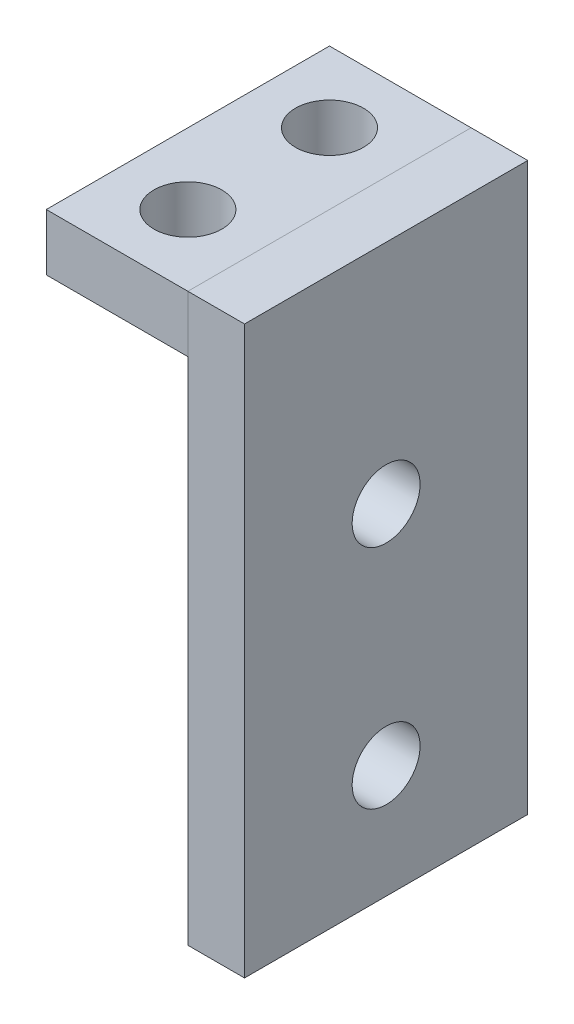
ISO-10303-21;
HEADER;
FILE_DESCRIPTION(('STEP AP214'),'2;1');
FILE_NAME('part.step','',(''),(''),'','','');
FILE_SCHEMA(('AUTOMOTIVE_DESIGN { 1 0 10303 214 1 1 1 1 }'));
ENDSEC;
DATA;
#1=APPLICATION_CONTEXT('core data for automotive mechanical design processes');
#2=APPLICATION_PROTOCOL_DEFINITION('international standard','automotive_design',2000,#1);
#3=PRODUCT_CONTEXT('',#1,'mechanical');
#4=PRODUCT('Part','Part','',(#3));
#5=PRODUCT_RELATED_PRODUCT_CATEGORY('part','',(#4));
#6=PRODUCT_DEFINITION_FORMATION('','',#4);
#7=PRODUCT_DEFINITION_CONTEXT('part definition',#1,'design');
#8=PRODUCT_DEFINITION('design','',#6,#7);
#9=PRODUCT_DEFINITION_SHAPE('','',#8);
#10=(LENGTH_UNIT() NAMED_UNIT(*) SI_UNIT(.MILLI.,.METRE.));
#11=(NAMED_UNIT(*) PLANE_ANGLE_UNIT() SI_UNIT($,.RADIAN.));
#12=(NAMED_UNIT(*) SI_UNIT($,.STERADIAN.) SOLID_ANGLE_UNIT());
#13=UNCERTAINTY_MEASURE_WITH_UNIT(LENGTH_MEASURE(1.E-05),#10,'distance_accuracy_value','');
#14=(GEOMETRIC_REPRESENTATION_CONTEXT(3) GLOBAL_UNCERTAINTY_ASSIGNED_CONTEXT((#13)) GLOBAL_UNIT_ASSIGNED_CONTEXT((#10,
#11,#12)) REPRESENTATION_CONTEXT('',''));
#15=CARTESIAN_POINT('',(0.,0.,0.));
#16=DIRECTION('',(0.,0.,1.));
#17=DIRECTION('',(1.,0.,0.));
#18=AXIS2_PLACEMENT_3D('',#15,#16,#17);
#19=CARTESIAN_POINT('',(6.35,-22.86,-12.7));
#20=DIRECTION('',(-1.,0.,0.));
#21=DIRECTION('',(0.,0.,1.));
#22=AXIS2_PLACEMENT_3D('',#19,#20,#21);
#23=PLANE('',#22);
#24=CARTESIAN_POINT('',(6.35,-7.62,-6.35));
#25=DIRECTION('',(-1.,0.,0.));
#26=DIRECTION('',(0.,0.,1.));
#27=AXIS2_PLACEMENT_3D('',#24,#25,#26);
#28=CIRCLE('',#27,1.524);
#29=CARTESIAN_POINT('',(6.35,-7.62,-4.826));
#30=VERTEX_POINT('',#29);
#31=EDGE_CURVE('E175',#30,#30,#28,.T.);
#32=ORIENTED_EDGE('',*,*,#31,.F.);
#33=EDGE_LOOP('',(#32));
#34=FACE_BOUND('',#33,.T.);
#35=CARTESIAN_POINT('',(6.35,-17.78,-6.35));
#36=DIRECTION('',(-1.,0.,0.));
#37=DIRECTION('',(0.,0.,1.));
#38=AXIS2_PLACEMENT_3D('',#35,#36,#37);
#39=CIRCLE('',#38,1.524);
#40=CARTESIAN_POINT('',(6.35,-17.78,-4.826));
#41=VERTEX_POINT('',#40);
#42=EDGE_CURVE('E177',#41,#41,#39,.T.);
#43=ORIENTED_EDGE('',*,*,#42,.F.);
#44=EDGE_LOOP('',(#43));
#45=FACE_BOUND('',#44,.T.);
#46=DIRECTION('',(0.,0.,1.));
#47=VECTOR('',#46,1.);
#48=CARTESIAN_POINT('',(6.35,2.54,-12.7));
#49=LINE('',#48,#47);
#50=CARTESIAN_POINT('',(6.35,2.54,-12.7));
#51=VERTEX_POINT('',#50);
#52=CARTESIAN_POINT('',(6.35,2.54,0.));
#53=VERTEX_POINT('',#52);
#54=EDGE_CURVE('E124',#51,#53,#49,.T.);
#55=ORIENTED_EDGE('',*,*,#54,.F.);
#56=DIRECTION('',(0.,1.,0.));
#57=VECTOR('',#56,1.);
#58=CARTESIAN_POINT('',(6.35,-22.86,-12.7));
#59=LINE('',#58,#57);
#60=CARTESIAN_POINT('',(6.35,-22.86,-12.7));
#61=VERTEX_POINT('',#60);
#62=EDGE_CURVE('E12',#61,#51,#59,.T.);
#63=ORIENTED_EDGE('',*,*,#62,.F.);
#64=DIRECTION('',(0.,0.,1.));
#65=VECTOR('',#64,1.);
#66=CARTESIAN_POINT('',(6.35,-22.86,-12.7));
#67=LINE('',#66,#65);
#68=CARTESIAN_POINT('',(6.35,-22.86,0.));
#69=VERTEX_POINT('',#68);
#70=EDGE_CURVE('E115',#61,#69,#67,.T.);
#71=ORIENTED_EDGE('',*,*,#70,.T.);
#72=DIRECTION('',(0.,1.,0.));
#73=VECTOR('',#72,1.);
#74=CARTESIAN_POINT('',(6.35,-22.86,0.));
#75=LINE('',#74,#73);
#76=EDGE_CURVE('E56',#69,#53,#75,.T.);
#77=ORIENTED_EDGE('',*,*,#76,.T.);
#78=EDGE_LOOP('',(#55,#63,#71,#77));
#79=FACE_BOUND('',#78,.T.);
#80=ADVANCED_FACE('F53',(#34,#45,#79),#23,.T.);
#81=CARTESIAN_POINT('',(6.35,-22.86,-12.7));
#82=DIRECTION('',(0.,0.,-1.));
#83=DIRECTION('',(-1.,0.,0.));
#84=AXIS2_PLACEMENT_3D('',#81,#82,#83);
#85=PLANE('',#84);
#86=DIRECTION('',(-1.,0.,0.));
#87=VECTOR('',#86,1.);
#88=CARTESIAN_POINT('',(6.35,2.54,-12.7));
#89=LINE('',#88,#87);
#90=CARTESIAN_POINT('',(8.89,2.54,-12.7));
#91=VERTEX_POINT('',#90);
#92=EDGE_CURVE('E118',#91,#51,#89,.T.);
#93=ORIENTED_EDGE('',*,*,#92,.F.);
#94=DIRECTION('',(0.,1.,0.));
#95=VECTOR('',#94,1.);
#96=CARTESIAN_POINT('',(8.89,-22.86,-12.7));
#97=LINE('',#96,#95);
#98=CARTESIAN_POINT('',(8.89,-22.86,-12.7));
#99=VERTEX_POINT('',#98);
#100=EDGE_CURVE('E63',#99,#91,#97,.T.);
#101=ORIENTED_EDGE('',*,*,#100,.F.);
#102=DIRECTION('',(-1.,0.,0.));
#103=VECTOR('',#102,1.);
#104=CARTESIAN_POINT('',(6.35,-22.86,-12.7));
#105=LINE('',#104,#103);
#106=EDGE_CURVE('E110',#99,#61,#105,.T.);
#107=ORIENTED_EDGE('',*,*,#106,.T.);
#108=ORIENTED_EDGE('',*,*,#62,.T.);
#109=EDGE_LOOP('',(#93,#101,#107,#108));
#110=FACE_BOUND('',#109,.T.);
#111=ADVANCED_FACE('F141',(#110),#85,.T.);
#112=CARTESIAN_POINT('',(8.89,-22.86,-12.7));
#113=DIRECTION('',(1.,0.,0.));
#114=DIRECTION('',(0.,0.,-1.));
#115=AXIS2_PLACEMENT_3D('',#112,#113,#114);
#116=PLANE('',#115);
#117=CARTESIAN_POINT('',(8.89,-7.62,-6.35));
#118=DIRECTION('',(-1.,0.,0.));
#119=DIRECTION('',(0.,0.,1.));
#120=AXIS2_PLACEMENT_3D('',#117,#118,#119);
#121=CIRCLE('',#120,1.524);
#122=CARTESIAN_POINT('',(8.89,-7.62,-4.826));
#123=VERTEX_POINT('',#122);
#124=EDGE_CURVE('E129',#123,#123,#121,.T.);
#125=ORIENTED_EDGE('',*,*,#124,.T.);
#126=EDGE_LOOP('',(#125));
#127=FACE_BOUND('',#126,.T.);
#128=CARTESIAN_POINT('',(8.89,-17.78,-6.35));
#129=DIRECTION('',(-1.,0.,0.));
#130=DIRECTION('',(0.,0.,1.));
#131=AXIS2_PLACEMENT_3D('',#128,#129,#130);
#132=CIRCLE('',#131,1.524);
#133=CARTESIAN_POINT('',(8.89,-17.78,-4.826));
#134=VERTEX_POINT('',#133);
#135=EDGE_CURVE('E183',#134,#134,#132,.T.);
#136=ORIENTED_EDGE('',*,*,#135,.T.);
#137=EDGE_LOOP('',(#136));
#138=FACE_BOUND('',#137,.T.);
#139=DIRECTION('',(0.,0.,-1.));
#140=VECTOR('',#139,1.);
#141=CARTESIAN_POINT('',(8.89,2.54,-12.7));
#142=LINE('',#141,#140);
#143=CARTESIAN_POINT('',(8.89,2.54,0.));
#144=VERTEX_POINT('',#143);
#145=EDGE_CURVE('E104',#144,#91,#142,.T.);
#146=ORIENTED_EDGE('',*,*,#145,.F.);
#147=DIRECTION('',(0.,1.,0.));
#148=VECTOR('',#147,1.);
#149=CARTESIAN_POINT('',(8.89,-22.86,0.));
#150=LINE('',#149,#148);
#151=CARTESIAN_POINT('',(8.89,-22.86,0.));
#152=VERTEX_POINT('',#151);
#153=EDGE_CURVE('E99',#152,#144,#150,.T.);
#154=ORIENTED_EDGE('',*,*,#153,.F.);
#155=DIRECTION('',(0.,0.,-1.));
#156=VECTOR('',#155,1.);
#157=CARTESIAN_POINT('',(8.89,-22.86,-12.7));
#158=LINE('',#157,#156);
#159=EDGE_CURVE('E102',#152,#99,#158,.T.);
#160=ORIENTED_EDGE('',*,*,#159,.T.);
#161=ORIENTED_EDGE('',*,*,#100,.T.);
#162=EDGE_LOOP('',(#146,#154,#160,#161));
#163=FACE_BOUND('',#162,.T.);
#164=ADVANCED_FACE('F101',(#127,#138,#163),#116,.T.);
#165=CARTESIAN_POINT('',(6.35,-22.86,0.));
#166=DIRECTION('',(0.,0.,1.));
#167=DIRECTION('',(1.,0.,0.));
#168=AXIS2_PLACEMENT_3D('',#165,#166,#167);
#169=PLANE('',#168);
#170=DIRECTION('',(1.,0.,0.));
#171=VECTOR('',#170,1.);
#172=CARTESIAN_POINT('',(6.35,2.54,0.));
#173=LINE('',#172,#171);
#174=EDGE_CURVE('E128',#53,#144,#173,.T.);
#175=ORIENTED_EDGE('',*,*,#174,.F.);
#176=ORIENTED_EDGE('',*,*,#76,.F.);
#177=DIRECTION('',(1.,0.,0.));
#178=VECTOR('',#177,1.);
#179=CARTESIAN_POINT('',(6.35,-22.86,0.));
#180=LINE('',#179,#178);
#181=EDGE_CURVE('E109',#69,#152,#180,.T.);
#182=ORIENTED_EDGE('',*,*,#181,.T.);
#183=ORIENTED_EDGE('',*,*,#153,.T.);
#184=EDGE_LOOP('',(#175,#176,#182,#183));
#185=FACE_BOUND('',#184,.T.);
#186=ADVANCED_FACE('F113',(#185),#169,.T.);
#187=CARTESIAN_POINT('',(0.,-22.86,0.));
#188=DIRECTION('',(0.,1.,0.));
#189=DIRECTION('',(0.,0.,1.));
#190=AXIS2_PLACEMENT_3D('',#187,#188,#189);
#191=PLANE('',#190);
#192=ORIENTED_EDGE('',*,*,#70,.F.);
#193=ORIENTED_EDGE('',*,*,#106,.F.);
#194=ORIENTED_EDGE('',*,*,#159,.F.);
#195=ORIENTED_EDGE('',*,*,#181,.F.);
#196=EDGE_LOOP('',(#192,#193,#194,#195));
#197=FACE_BOUND('',#196,.T.);
#198=ADVANCED_FACE('F108',(#197),#191,.F.);
#199=CARTESIAN_POINT('',(0.,2.54,0.));
#200=DIRECTION('',(0.,1.,0.));
#201=DIRECTION('',(0.,0.,1.));
#202=AXIS2_PLACEMENT_3D('',#199,#200,#201);
#203=PLANE('',#202);
#204=ORIENTED_EDGE('',*,*,#54,.T.);
#205=ORIENTED_EDGE('',*,*,#174,.T.);
#206=ORIENTED_EDGE('',*,*,#145,.T.);
#207=ORIENTED_EDGE('',*,*,#92,.T.);
#208=EDGE_LOOP('',(#204,#205,#206,#207));
#209=FACE_BOUND('',#208,.T.);
#210=ADVANCED_FACE('F140',(#209),#203,.T.);
#211=CARTESIAN_POINT('',(8.89,-17.78,-6.35));
#212=DIRECTION('',(-1.,0.,0.));
#213=DIRECTION('',(0.,0.,1.));
#214=AXIS2_PLACEMENT_3D('',#211,#212,#213);
#215=CYLINDRICAL_SURFACE('',#214,1.524);
#216=ORIENTED_EDGE('',*,*,#135,.F.);
#217=EDGE_LOOP('',(#216));
#218=FACE_BOUND('',#217,.T.);
#219=ORIENTED_EDGE('',*,*,#42,.T.);
#220=EDGE_LOOP('',(#219));
#221=FACE_BOUND('',#220,.T.);
#222=ADVANCED_FACE('F160',(#218,#221),#215,.F.);
#223=CARTESIAN_POINT('',(8.89,-7.62,-6.35));
#224=DIRECTION('',(-1.,0.,0.));
#225=DIRECTION('',(0.,0.,1.));
#226=AXIS2_PLACEMENT_3D('',#223,#224,#225);
#227=CYLINDRICAL_SURFACE('',#226,1.524);
#228=ORIENTED_EDGE('',*,*,#124,.F.);
#229=EDGE_LOOP('',(#228));
#230=FACE_BOUND('',#229,.T.);
#231=ORIENTED_EDGE('',*,*,#31,.T.);
#232=EDGE_LOOP('',(#231));
#233=FACE_BOUND('',#232,.T.);
#234=ADVANCED_FACE('F164',(#230,#233),#227,.F.);
#235=CLOSED_SHELL('',(#80,#111,#164,#186,#198,#210,#222,#234));
#236=MANIFOLD_SOLID_BREP('B2',#235);
#237=CARTESIAN_POINT('',(0.,2.54,0.));
#238=DIRECTION('',(0.,-1.,0.));
#239=DIRECTION('',(0.,0.,-1.));
#240=AXIS2_PLACEMENT_3D('',#237,#238,#239);
#241=PLANE('',#240);
#242=DIRECTION('',(0.,0.,1.));
#243=VECTOR('',#242,1.);
#244=CARTESIAN_POINT('',(0.,2.54,0.));
#245=LINE('',#244,#243);
#246=CARTESIAN_POINT('',(0.,2.54,-12.7));
#247=VERTEX_POINT('',#246);
#248=CARTESIAN_POINT('',(0.,2.54,0.));
#249=VERTEX_POINT('',#248);
#250=EDGE_CURVE('E303',#247,#249,#245,.T.);
#251=ORIENTED_EDGE('',*,*,#250,.T.);
#252=DIRECTION('',(1.,0.,0.));
#253=VECTOR('',#252,1.);
#254=CARTESIAN_POINT('',(0.,2.54,0.));
#255=LINE('',#254,#253);
#256=CARTESIAN_POINT('',(6.35,2.54,0.));
#257=VERTEX_POINT('',#256);
#258=EDGE_CURVE('E298',#249,#257,#255,.T.);
#259=ORIENTED_EDGE('',*,*,#258,.T.);
#260=DIRECTION('',(0.,0.,-1.));
#261=VECTOR('',#260,1.);
#262=CARTESIAN_POINT('',(6.35,2.54,0.));
#263=LINE('',#262,#261);
#264=CARTESIAN_POINT('',(6.35,2.54,-12.7));
#265=VERTEX_POINT('',#264);
#266=EDGE_CURVE('E301',#257,#265,#263,.T.);
#267=ORIENTED_EDGE('',*,*,#266,.T.);
#268=DIRECTION('',(-1.,0.,0.));
#269=VECTOR('',#268,1.);
#270=CARTESIAN_POINT('',(0.,2.54,-12.7));
#271=LINE('',#270,#269);
#272=EDGE_CURVE('E268',#265,#247,#271,.T.);
#273=ORIENTED_EDGE('',*,*,#272,.T.);
#274=EDGE_LOOP('',(#251,#259,#267,#273));
#275=FACE_BOUND('',#274,.T.);
#276=CARTESIAN_POINT('',(3.175,2.54,-3.175));
#277=DIRECTION('',(0.,1.,0.));
#278=DIRECTION('',(0.,0.,1.));
#279=AXIS2_PLACEMENT_3D('',#276,#277,#278);
#280=CIRCLE('',#279,1.524);
#281=CARTESIAN_POINT('',(3.175,2.54,-1.651));
#282=VERTEX_POINT('',#281);
#283=EDGE_CURVE('E318',#282,#282,#280,.T.);
#284=ORIENTED_EDGE('',*,*,#283,.F.);
#285=EDGE_LOOP('',(#284));
#286=FACE_BOUND('',#285,.T.);
#287=CARTESIAN_POINT('',(3.175,2.54,-9.525));
#288=DIRECTION('',(0.,1.,0.));
#289=DIRECTION('',(0.,0.,1.));
#290=AXIS2_PLACEMENT_3D('',#287,#288,#289);
#291=CIRCLE('',#290,1.524);
#292=CARTESIAN_POINT('',(3.175,2.54,-8.001));
#293=VERTEX_POINT('',#292);
#294=EDGE_CURVE('E333',#293,#293,#291,.T.);
#295=ORIENTED_EDGE('',*,*,#294,.F.);
#296=EDGE_LOOP('',(#295));
#297=FACE_BOUND('',#296,.T.);
#298=ADVANCED_FACE('F251',(#275,#286,#297),#241,.F.);
#299=CARTESIAN_POINT('',(0.,0.,0.));
#300=DIRECTION('',(0.,-1.,0.));
#301=DIRECTION('',(0.,0.,-1.));
#302=AXIS2_PLACEMENT_3D('',#299,#300,#301);
#303=PLANE('',#302);
#304=CARTESIAN_POINT('',(3.175,0.,-3.175));
#305=DIRECTION('',(0.,1.,0.));
#306=DIRECTION('',(0.,0.,1.));
#307=AXIS2_PLACEMENT_3D('',#304,#305,#306);
#308=CIRCLE('',#307,1.524);
#309=CARTESIAN_POINT('',(3.175,0.,-1.651));
#310=VERTEX_POINT('',#309);
#311=EDGE_CURVE('E330',#310,#310,#308,.T.);
#312=ORIENTED_EDGE('',*,*,#311,.T.);
#313=EDGE_LOOP('',(#312));
#314=FACE_BOUND('',#313,.T.);
#315=DIRECTION('',(0.,0.,1.));
#316=VECTOR('',#315,1.);
#317=CARTESIAN_POINT('',(0.,0.,0.));
#318=LINE('',#317,#316);
#319=CARTESIAN_POINT('',(0.,0.,-12.7));
#320=VERTEX_POINT('',#319);
#321=CARTESIAN_POINT('',(0.,0.,0.));
#322=VERTEX_POINT('',#321);
#323=EDGE_CURVE('E315',#320,#322,#318,.T.);
#324=ORIENTED_EDGE('',*,*,#323,.F.);
#325=DIRECTION('',(-1.,0.,0.));
#326=VECTOR('',#325,1.);
#327=CARTESIAN_POINT('',(0.,0.,-12.7));
#328=LINE('',#327,#326);
#329=CARTESIAN_POINT('',(6.35,0.,-12.7));
#330=VERTEX_POINT('',#329);
#331=EDGE_CURVE('E291',#330,#320,#328,.T.);
#332=ORIENTED_EDGE('',*,*,#331,.F.);
#333=DIRECTION('',(0.,0.,-1.));
#334=VECTOR('',#333,1.);
#335=CARTESIAN_POINT('',(6.35,0.,0.));
#336=LINE('',#335,#334);
#337=CARTESIAN_POINT('',(6.35,0.,0.));
#338=VERTEX_POINT('',#337);
#339=EDGE_CURVE('E285',#338,#330,#336,.T.);
#340=ORIENTED_EDGE('',*,*,#339,.F.);
#341=DIRECTION('',(1.,0.,0.));
#342=VECTOR('',#341,1.);
#343=CARTESIAN_POINT('',(0.,0.,0.));
#344=LINE('',#343,#342);
#345=EDGE_CURVE('E307',#322,#338,#344,.T.);
#346=ORIENTED_EDGE('',*,*,#345,.F.);
#347=EDGE_LOOP('',(#324,#332,#340,#346));
#348=FACE_BOUND('',#347,.T.);
#349=CARTESIAN_POINT('',(3.175,0.,-9.525));
#350=DIRECTION('',(0.,1.,0.));
#351=DIRECTION('',(0.,0.,1.));
#352=AXIS2_PLACEMENT_3D('',#349,#350,#351);
#353=CIRCLE('',#352,1.524);
#354=CARTESIAN_POINT('',(3.175,0.,-8.001));
#355=VERTEX_POINT('',#354);
#356=EDGE_CURVE('E336',#355,#355,#353,.T.);
#357=ORIENTED_EDGE('',*,*,#356,.T.);
#358=EDGE_LOOP('',(#357));
#359=FACE_BOUND('',#358,.T.);
#360=ADVANCED_FACE('F326',(#314,#348,#359),#303,.T.);
#361=CARTESIAN_POINT('',(0.,2.54,0.));
#362=DIRECTION('',(1.,0.,0.));
#363=DIRECTION('',(0.,0.,-1.));
#364=AXIS2_PLACEMENT_3D('',#361,#362,#363);
#365=PLANE('',#364);
#366=ORIENTED_EDGE('',*,*,#323,.T.);
#367=DIRECTION('',(0.,-1.,0.));
#368=VECTOR('',#367,1.);
#369=CARTESIAN_POINT('',(0.,2.54,0.));
#370=LINE('',#369,#368);
#371=EDGE_CURVE('E51',#249,#322,#370,.T.);
#372=ORIENTED_EDGE('',*,*,#371,.F.);
#373=ORIENTED_EDGE('',*,*,#250,.F.);
#374=DIRECTION('',(0.,-1.,0.));
#375=VECTOR('',#374,1.);
#376=CARTESIAN_POINT('',(0.,2.54,-12.7));
#377=LINE('',#376,#375);
#378=EDGE_CURVE('E311',#247,#320,#377,.T.);
#379=ORIENTED_EDGE('',*,*,#378,.T.);
#380=EDGE_LOOP('',(#366,#372,#373,#379));
#381=FACE_BOUND('',#380,.T.);
#382=ADVANCED_FACE('F253',(#381),#365,.F.);
#383=CARTESIAN_POINT('',(0.,2.54,0.));
#384=DIRECTION('',(0.,0.,-1.));
#385=DIRECTION('',(-1.,0.,0.));
#386=AXIS2_PLACEMENT_3D('',#383,#384,#385);
#387=PLANE('',#386);
#388=ORIENTED_EDGE('',*,*,#345,.T.);
#389=DIRECTION('',(0.,-1.,0.));
#390=VECTOR('',#389,1.);
#391=CARTESIAN_POINT('',(6.35,2.54,0.));
#392=LINE('',#391,#390);
#393=EDGE_CURVE('E260',#257,#338,#392,.T.);
#394=ORIENTED_EDGE('',*,*,#393,.F.);
#395=ORIENTED_EDGE('',*,*,#258,.F.);
#396=ORIENTED_EDGE('',*,*,#371,.T.);
#397=EDGE_LOOP('',(#388,#394,#395,#396));
#398=FACE_BOUND('',#397,.T.);
#399=ADVANCED_FACE('F306',(#398),#387,.F.);
#400=CARTESIAN_POINT('',(6.35,2.54,0.));
#401=DIRECTION('',(-1.,0.,0.));
#402=DIRECTION('',(0.,0.,1.));
#403=AXIS2_PLACEMENT_3D('',#400,#401,#402);
#404=PLANE('',#403);
#405=ORIENTED_EDGE('',*,*,#339,.T.);
#406=DIRECTION('',(0.,-1.,0.));
#407=VECTOR('',#406,1.);
#408=CARTESIAN_POINT('',(6.35,2.54,-12.7));
#409=LINE('',#408,#407);
#410=EDGE_CURVE('E308',#265,#330,#409,.T.);
#411=ORIENTED_EDGE('',*,*,#410,.F.);
#412=ORIENTED_EDGE('',*,*,#266,.F.);
#413=ORIENTED_EDGE('',*,*,#393,.T.);
#414=EDGE_LOOP('',(#405,#411,#412,#413));
#415=FACE_BOUND('',#414,.T.);
#416=ADVANCED_FACE('F309',(#415),#404,.F.);
#417=CARTESIAN_POINT('',(0.,2.54,-12.7));
#418=DIRECTION('',(0.,0.,1.));
#419=DIRECTION('',(1.,0.,0.));
#420=AXIS2_PLACEMENT_3D('',#417,#418,#419);
#421=PLANE('',#420);
#422=ORIENTED_EDGE('',*,*,#331,.T.);
#423=ORIENTED_EDGE('',*,*,#378,.F.);
#424=ORIENTED_EDGE('',*,*,#272,.F.);
#425=ORIENTED_EDGE('',*,*,#410,.T.);
#426=EDGE_LOOP('',(#422,#423,#424,#425));
#427=FACE_BOUND('',#426,.T.);
#428=ADVANCED_FACE('F323',(#427),#421,.F.);
#429=CARTESIAN_POINT('',(3.175,2.54,-3.175));
#430=DIRECTION('',(0.,-1.,0.));
#431=DIRECTION('',(0.,0.,-1.));
#432=AXIS2_PLACEMENT_3D('',#429,#430,#431);
#433=CYLINDRICAL_SURFACE('',#432,1.524);
#434=ORIENTED_EDGE('',*,*,#283,.T.);
#435=EDGE_LOOP('',(#434));
#436=FACE_BOUND('',#435,.T.);
#437=ORIENTED_EDGE('',*,*,#311,.F.);
#438=EDGE_LOOP('',(#437));
#439=FACE_BOUND('',#438,.T.);
#440=ADVANCED_FACE('F353',(#436,#439),#433,.F.);
#441=CARTESIAN_POINT('',(3.175,2.54,-9.525));
#442=DIRECTION('',(0.,-1.,0.));
#443=DIRECTION('',(0.,0.,-1.));
#444=AXIS2_PLACEMENT_3D('',#441,#442,#443);
#445=CYLINDRICAL_SURFACE('',#444,1.524);
#446=ORIENTED_EDGE('',*,*,#294,.T.);
#447=EDGE_LOOP('',(#446));
#448=FACE_BOUND('',#447,.T.);
#449=ORIENTED_EDGE('',*,*,#356,.F.);
#450=EDGE_LOOP('',(#449));
#451=FACE_BOUND('',#450,.T.);
#452=ADVANCED_FACE('F342',(#448,#451),#445,.F.);
#453=CLOSED_SHELL('',(#298,#360,#382,#399,#416,#428,#440,#452));
#454=MANIFOLD_SOLID_BREP('B6',#453);
#455=ADVANCED_BREP_SHAPE_REPRESENTATION('',(#18,#236,#454),#14);
#456=SHAPE_DEFINITION_REPRESENTATION(#9,#455);
ENDSEC;
END-ISO-10303-21;
